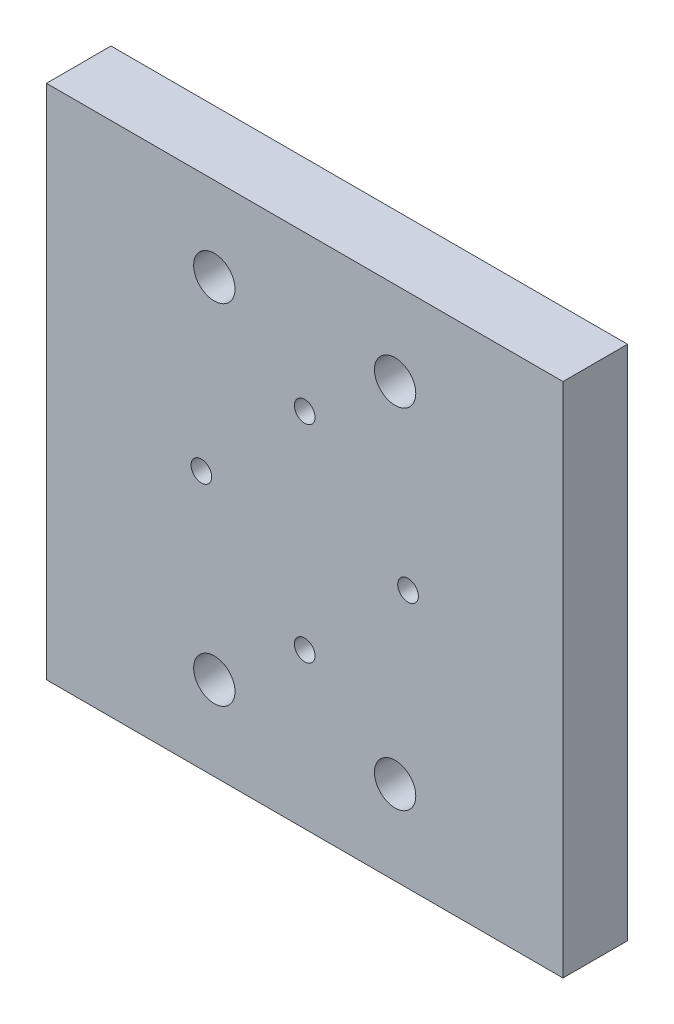
ISO-10303-21;
HEADER;
FILE_DESCRIPTION(('STEP AP214'),'2;1');
FILE_NAME('part.step','',(''),(''),'','','');
FILE_SCHEMA(('AUTOMOTIVE_DESIGN { 1 0 10303 214 1 1 1 1 }'));
ENDSEC;
DATA;
#1=APPLICATION_CONTEXT('core data for automotive mechanical design processes');
#2=APPLICATION_PROTOCOL_DEFINITION('international standard','automotive_design',2000,#1);
#3=PRODUCT_CONTEXT('',#1,'mechanical');
#4=PRODUCT('Part','Part','',(#3));
#5=PRODUCT_RELATED_PRODUCT_CATEGORY('part','',(#4));
#6=PRODUCT_DEFINITION_FORMATION('','',#4);
#7=PRODUCT_DEFINITION_CONTEXT('part definition',#1,'design');
#8=PRODUCT_DEFINITION('design','',#6,#7);
#9=PRODUCT_DEFINITION_SHAPE('','',#8);
#10=(LENGTH_UNIT() NAMED_UNIT(*) SI_UNIT(.MILLI.,.METRE.));
#11=(NAMED_UNIT(*) PLANE_ANGLE_UNIT() SI_UNIT($,.RADIAN.));
#12=(NAMED_UNIT(*) SI_UNIT($,.STERADIAN.) SOLID_ANGLE_UNIT());
#13=UNCERTAINTY_MEASURE_WITH_UNIT(LENGTH_MEASURE(1.E-05),#10,'distance_accuracy_value','');
#14=(GEOMETRIC_REPRESENTATION_CONTEXT(3) GLOBAL_UNCERTAINTY_ASSIGNED_CONTEXT((#13)) GLOBAL_UNIT_ASSIGNED_CONTEXT((#10,
#11,#12)) REPRESENTATION_CONTEXT('',''));
#15=CARTESIAN_POINT('',(0.,0.,0.));
#16=DIRECTION('',(0.,0.,1.));
#17=DIRECTION('',(1.,0.,0.));
#18=AXIS2_PLACEMENT_3D('',#15,#16,#17);
#19=CARTESIAN_POINT('',(0.,0.,5.));
#20=DIRECTION('',(0.,0.,1.));
#21=DIRECTION('',(1.,0.,0.));
#22=AXIS2_PLACEMENT_3D('',#19,#20,#21);
#23=PLANE('',#22);
#24=CARTESIAN_POINT('',(7.,-13.5,5.));
#25=DIRECTION('',(0.,0.,1.));
#26=DIRECTION('',(1.,0.,0.));
#27=AXIS2_PLACEMENT_3D('',#24,#25,#26);
#28=CIRCLE('',#27,1.6);
#29=CARTESIAN_POINT('',(8.6,-13.5,5.));
#30=VERTEX_POINT('',#29);
#31=EDGE_CURVE('E180',#30,#30,#28,.T.);
#32=ORIENTED_EDGE('',*,*,#31,.F.);
#33=EDGE_LOOP('',(#32));
#34=FACE_BOUND('',#33,.T.);
#35=CARTESIAN_POINT('',(7.,13.5,5.));
#36=DIRECTION('',(0.,0.,1.));
#37=DIRECTION('',(1.,0.,0.));
#38=AXIS2_PLACEMENT_3D('',#35,#36,#37);
#39=CIRCLE('',#38,1.6);
#40=CARTESIAN_POINT('',(8.6,13.5,5.));
#41=VERTEX_POINT('',#40);
#42=EDGE_CURVE('E164',#41,#41,#39,.T.);
#43=ORIENTED_EDGE('',*,*,#42,.F.);
#44=EDGE_LOOP('',(#43));
#45=FACE_BOUND('',#44,.T.);
#46=CARTESIAN_POINT('',(8.,0.,5.));
#47=DIRECTION('',(0.,0.,1.));
#48=DIRECTION('',(1.,0.,0.));
#49=AXIS2_PLACEMENT_3D('',#46,#47,#48);
#50=CIRCLE('',#49,0.800000000000001);
#51=CARTESIAN_POINT('',(8.8,0.,5.));
#52=VERTEX_POINT('',#51);
#53=EDGE_CURVE('E148',#52,#52,#50,.T.);
#54=ORIENTED_EDGE('',*,*,#53,.F.);
#55=EDGE_LOOP('',(#54));
#56=FACE_BOUND('',#55,.T.);
#57=CARTESIAN_POINT('',(0.,8.,5.));
#58=DIRECTION('',(0.,0.,1.));
#59=DIRECTION('',(1.,0.,0.));
#60=AXIS2_PLACEMENT_3D('',#57,#58,#59);
#61=CIRCLE('',#60,0.8);
#62=CARTESIAN_POINT('',(0.8,8.,5.));
#63=VERTEX_POINT('',#62);
#64=EDGE_CURVE('E118',#63,#63,#61,.T.);
#65=ORIENTED_EDGE('',*,*,#64,.F.);
#66=EDGE_LOOP('',(#65));
#67=FACE_BOUND('',#66,.T.);
#68=DIRECTION('',(0.,1.,0.));
#69=VECTOR('',#68,1.);
#70=CARTESIAN_POINT('',(20.,20.,5.));
#71=LINE('',#70,#69);
#72=CARTESIAN_POINT('',(20.,-20.,5.));
#73=VERTEX_POINT('',#72);
#74=CARTESIAN_POINT('',(20.,20.,5.));
#75=VERTEX_POINT('',#74);
#76=EDGE_CURVE('E98',#73,#75,#71,.T.);
#77=ORIENTED_EDGE('',*,*,#76,.T.);
#78=DIRECTION('',(-1.,0.,0.));
#79=VECTOR('',#78,1.);
#80=CARTESIAN_POINT('',(-20.,20.,5.));
#81=LINE('',#80,#79);
#82=CARTESIAN_POINT('',(-20.,20.,5.));
#83=VERTEX_POINT('',#82);
#84=EDGE_CURVE('E93',#75,#83,#81,.T.);
#85=ORIENTED_EDGE('',*,*,#84,.T.);
#86=DIRECTION('',(0.,-1.,0.));
#87=VECTOR('',#86,1.);
#88=CARTESIAN_POINT('',(-20.,20.,5.));
#89=LINE('',#88,#87);
#90=CARTESIAN_POINT('',(-20.,-20.,5.));
#91=VERTEX_POINT('',#90);
#92=EDGE_CURVE('E96',#83,#91,#89,.T.);
#93=ORIENTED_EDGE('',*,*,#92,.T.);
#94=DIRECTION('',(1.,0.,0.));
#95=VECTOR('',#94,1.);
#96=CARTESIAN_POINT('',(-20.,-20.,5.));
#97=LINE('',#96,#95);
#98=EDGE_CURVE('E63',#91,#73,#97,.T.);
#99=ORIENTED_EDGE('',*,*,#98,.T.);
#100=EDGE_LOOP('',(#77,#85,#93,#99));
#101=FACE_BOUND('',#100,.T.);
#102=CARTESIAN_POINT('',(-8.,0.,5.));
#103=DIRECTION('',(0.,0.,1.));
#104=DIRECTION('',(1.,0.,0.));
#105=AXIS2_PLACEMENT_3D('',#102,#103,#104);
#106=CIRCLE('',#105,0.800000000000001);
#107=CARTESIAN_POINT('',(-7.2,0.,5.));
#108=VERTEX_POINT('',#107);
#109=EDGE_CURVE('E140',#108,#108,#106,.T.);
#110=ORIENTED_EDGE('',*,*,#109,.F.);
#111=EDGE_LOOP('',(#110));
#112=FACE_BOUND('',#111,.T.);
#113=CARTESIAN_POINT('',(0.,-8.,5.));
#114=DIRECTION('',(0.,0.,1.));
#115=DIRECTION('',(1.,0.,0.));
#116=AXIS2_PLACEMENT_3D('',#113,#114,#115);
#117=CIRCLE('',#116,0.8);
#118=CARTESIAN_POINT('',(0.8,-8.,5.));
#119=VERTEX_POINT('',#118);
#120=EDGE_CURVE('E156',#119,#119,#117,.T.);
#121=ORIENTED_EDGE('',*,*,#120,.F.);
#122=EDGE_LOOP('',(#121));
#123=FACE_BOUND('',#122,.T.);
#124=CARTESIAN_POINT('',(-7.,13.5,5.));
#125=DIRECTION('',(0.,0.,1.));
#126=DIRECTION('',(1.,0.,0.));
#127=AXIS2_PLACEMENT_3D('',#124,#125,#126);
#128=CIRCLE('',#127,1.6);
#129=CARTESIAN_POINT('',(-5.4,13.5,5.));
#130=VERTEX_POINT('',#129);
#131=EDGE_CURVE('E172',#130,#130,#128,.T.);
#132=ORIENTED_EDGE('',*,*,#131,.F.);
#133=EDGE_LOOP('',(#132));
#134=FACE_BOUND('',#133,.T.);
#135=CARTESIAN_POINT('',(-7.,-13.5,5.));
#136=DIRECTION('',(0.,0.,1.));
#137=DIRECTION('',(1.,0.,0.));
#138=AXIS2_PLACEMENT_3D('',#135,#136,#137);
#139=CIRCLE('',#138,1.6);
#140=CARTESIAN_POINT('',(-5.4,-13.5,5.));
#141=VERTEX_POINT('',#140);
#142=EDGE_CURVE('E188',#141,#141,#139,.T.);
#143=ORIENTED_EDGE('',*,*,#142,.F.);
#144=EDGE_LOOP('',(#143));
#145=FACE_BOUND('',#144,.T.);
#146=ADVANCED_FACE('F45',(#34,#45,#56,#67,#101,#112,#123,#134,#145),#23,.T.);
#147=CARTESIAN_POINT('',(0.,0.,0.));
#148=DIRECTION('',(0.,0.,1.));
#149=DIRECTION('',(1.,0.,0.));
#150=AXIS2_PLACEMENT_3D('',#147,#148,#149);
#151=PLANE('',#150);
#152=DIRECTION('',(0.,1.,0.));
#153=VECTOR('',#152,1.);
#154=CARTESIAN_POINT('',(20.,20.,0.));
#155=LINE('',#154,#153);
#156=CARTESIAN_POINT('',(20.,-20.,0.));
#157=VERTEX_POINT('',#156);
#158=CARTESIAN_POINT('',(20.,20.,0.));
#159=VERTEX_POINT('',#158);
#160=EDGE_CURVE('E114',#157,#159,#155,.T.);
#161=ORIENTED_EDGE('',*,*,#160,.F.);
#162=DIRECTION('',(1.,0.,0.));
#163=VECTOR('',#162,1.);
#164=CARTESIAN_POINT('',(-20.,-20.,0.));
#165=LINE('',#164,#163);
#166=CARTESIAN_POINT('',(-20.,-20.,0.));
#167=VERTEX_POINT('',#166);
#168=EDGE_CURVE('E86',#167,#157,#165,.T.);
#169=ORIENTED_EDGE('',*,*,#168,.F.);
#170=DIRECTION('',(0.,-1.,0.));
#171=VECTOR('',#170,1.);
#172=CARTESIAN_POINT('',(-20.,20.,0.));
#173=LINE('',#172,#171);
#174=CARTESIAN_POINT('',(-20.,20.,0.));
#175=VERTEX_POINT('',#174);
#176=EDGE_CURVE('E80',#175,#167,#173,.T.);
#177=ORIENTED_EDGE('',*,*,#176,.F.);
#178=DIRECTION('',(-1.,0.,0.));
#179=VECTOR('',#178,1.);
#180=CARTESIAN_POINT('',(-20.,20.,0.));
#181=LINE('',#180,#179);
#182=EDGE_CURVE('E103',#159,#175,#181,.T.);
#183=ORIENTED_EDGE('',*,*,#182,.F.);
#184=EDGE_LOOP('',(#161,#169,#177,#183));
#185=FACE_BOUND('',#184,.T.);
#186=CARTESIAN_POINT('',(0.,8.,0.));
#187=DIRECTION('',(0.,0.,1.));
#188=DIRECTION('',(1.,0.,0.));
#189=AXIS2_PLACEMENT_3D('',#186,#187,#188);
#190=CIRCLE('',#189,0.8);
#191=CARTESIAN_POINT('',(0.8,8.,0.));
#192=VERTEX_POINT('',#191);
#193=EDGE_CURVE('E136',#192,#192,#190,.T.);
#194=ORIENTED_EDGE('',*,*,#193,.T.);
#195=EDGE_LOOP('',(#194));
#196=FACE_BOUND('',#195,.T.);
#197=CARTESIAN_POINT('',(-8.,0.,0.));
#198=DIRECTION('',(0.,0.,1.));
#199=DIRECTION('',(1.,0.,0.));
#200=AXIS2_PLACEMENT_3D('',#197,#198,#199);
#201=CIRCLE('',#200,0.800000000000001);
#202=CARTESIAN_POINT('',(-7.2,0.,0.));
#203=VERTEX_POINT('',#202);
#204=EDGE_CURVE('E144',#203,#203,#201,.T.);
#205=ORIENTED_EDGE('',*,*,#204,.T.);
#206=EDGE_LOOP('',(#205));
#207=FACE_BOUND('',#206,.T.);
#208=CARTESIAN_POINT('',(8.,0.,0.));
#209=DIRECTION('',(0.,0.,1.));
#210=DIRECTION('',(1.,0.,0.));
#211=AXIS2_PLACEMENT_3D('',#208,#209,#210);
#212=CIRCLE('',#211,0.800000000000001);
#213=CARTESIAN_POINT('',(8.8,0.,0.));
#214=VERTEX_POINT('',#213);
#215=EDGE_CURVE('E152',#214,#214,#212,.T.);
#216=ORIENTED_EDGE('',*,*,#215,.T.);
#217=EDGE_LOOP('',(#216));
#218=FACE_BOUND('',#217,.T.);
#219=CARTESIAN_POINT('',(0.,-8.,0.));
#220=DIRECTION('',(0.,0.,1.));
#221=DIRECTION('',(1.,0.,0.));
#222=AXIS2_PLACEMENT_3D('',#219,#220,#221);
#223=CIRCLE('',#222,0.8);
#224=CARTESIAN_POINT('',(0.8,-8.,0.));
#225=VERTEX_POINT('',#224);
#226=EDGE_CURVE('E160',#225,#225,#223,.T.);
#227=ORIENTED_EDGE('',*,*,#226,.T.);
#228=EDGE_LOOP('',(#227));
#229=FACE_BOUND('',#228,.T.);
#230=CARTESIAN_POINT('',(7.,13.5,0.));
#231=DIRECTION('',(0.,0.,1.));
#232=DIRECTION('',(1.,0.,0.));
#233=AXIS2_PLACEMENT_3D('',#230,#231,#232);
#234=CIRCLE('',#233,1.6);
#235=CARTESIAN_POINT('',(8.6,13.5,0.));
#236=VERTEX_POINT('',#235);
#237=EDGE_CURVE('E168',#236,#236,#234,.T.);
#238=ORIENTED_EDGE('',*,*,#237,.T.);
#239=EDGE_LOOP('',(#238));
#240=FACE_BOUND('',#239,.T.);
#241=CARTESIAN_POINT('',(-7.,13.5,0.));
#242=DIRECTION('',(0.,0.,1.));
#243=DIRECTION('',(1.,0.,0.));
#244=AXIS2_PLACEMENT_3D('',#241,#242,#243);
#245=CIRCLE('',#244,1.6);
#246=CARTESIAN_POINT('',(-5.4,13.5,0.));
#247=VERTEX_POINT('',#246);
#248=EDGE_CURVE('E176',#247,#247,#245,.T.);
#249=ORIENTED_EDGE('',*,*,#248,.T.);
#250=EDGE_LOOP('',(#249));
#251=FACE_BOUND('',#250,.T.);
#252=CARTESIAN_POINT('',(7.,-13.5,0.));
#253=DIRECTION('',(0.,0.,1.));
#254=DIRECTION('',(1.,0.,0.));
#255=AXIS2_PLACEMENT_3D('',#252,#253,#254);
#256=CIRCLE('',#255,1.6);
#257=CARTESIAN_POINT('',(8.6,-13.5,0.));
#258=VERTEX_POINT('',#257);
#259=EDGE_CURVE('E184',#258,#258,#256,.T.);
#260=ORIENTED_EDGE('',*,*,#259,.T.);
#261=EDGE_LOOP('',(#260));
#262=FACE_BOUND('',#261,.T.);
#263=CARTESIAN_POINT('',(-7.,-13.5,0.));
#264=DIRECTION('',(0.,0.,1.));
#265=DIRECTION('',(1.,0.,0.));
#266=AXIS2_PLACEMENT_3D('',#263,#264,#265);
#267=CIRCLE('',#266,1.6);
#268=CARTESIAN_POINT('',(-5.4,-13.5,0.));
#269=VERTEX_POINT('',#268);
#270=EDGE_CURVE('E192',#269,#269,#267,.T.);
#271=ORIENTED_EDGE('',*,*,#270,.T.);
#272=EDGE_LOOP('',(#271));
#273=FACE_BOUND('',#272,.T.);
#274=ADVANCED_FACE('F131',(#185,#196,#207,#218,#229,#240,#251,#262,#273),#151,.F.);
#275=CARTESIAN_POINT('',(20.,20.,5.));
#276=DIRECTION('',(-1.,0.,0.));
#277=DIRECTION('',(0.,-1.,0.));
#278=AXIS2_PLACEMENT_3D('',#275,#276,#277);
#279=PLANE('',#278);
#280=ORIENTED_EDGE('',*,*,#160,.T.);
#281=DIRECTION('',(0.,0.,-1.));
#282=VECTOR('',#281,1.);
#283=CARTESIAN_POINT('',(20.,20.,5.));
#284=LINE('',#283,#282);
#285=EDGE_CURVE('E11',#75,#159,#284,.T.);
#286=ORIENTED_EDGE('',*,*,#285,.F.);
#287=ORIENTED_EDGE('',*,*,#76,.F.);
#288=DIRECTION('',(0.,0.,-1.));
#289=VECTOR('',#288,1.);
#290=CARTESIAN_POINT('',(20.,-20.,5.));
#291=LINE('',#290,#289);
#292=EDGE_CURVE('E110',#73,#157,#291,.T.);
#293=ORIENTED_EDGE('',*,*,#292,.T.);
#294=EDGE_LOOP('',(#280,#286,#287,#293));
#295=FACE_BOUND('',#294,.T.);
#296=ADVANCED_FACE('F47',(#295),#279,.F.);
#297=CARTESIAN_POINT('',(-20.,20.,5.));
#298=DIRECTION('',(0.,-1.,0.));
#299=DIRECTION('',(0.,0.,-1.));
#300=AXIS2_PLACEMENT_3D('',#297,#298,#299);
#301=PLANE('',#300);
#302=ORIENTED_EDGE('',*,*,#182,.T.);
#303=DIRECTION('',(0.,0.,-1.));
#304=VECTOR('',#303,1.);
#305=CARTESIAN_POINT('',(-20.,20.,5.));
#306=LINE('',#305,#304);
#307=EDGE_CURVE('E55',#83,#175,#306,.T.);
#308=ORIENTED_EDGE('',*,*,#307,.F.);
#309=ORIENTED_EDGE('',*,*,#84,.F.);
#310=ORIENTED_EDGE('',*,*,#285,.T.);
#311=EDGE_LOOP('',(#302,#308,#309,#310));
#312=FACE_BOUND('',#311,.T.);
#313=ADVANCED_FACE('F102',(#312),#301,.F.);
#314=CARTESIAN_POINT('',(-20.,20.,5.));
#315=DIRECTION('',(1.,0.,0.));
#316=DIRECTION('',(0.,1.,0.));
#317=AXIS2_PLACEMENT_3D('',#314,#315,#316);
#318=PLANE('',#317);
#319=ORIENTED_EDGE('',*,*,#176,.T.);
#320=DIRECTION('',(0.,0.,-1.));
#321=VECTOR('',#320,1.);
#322=CARTESIAN_POINT('',(-20.,-20.,5.));
#323=LINE('',#322,#321);
#324=EDGE_CURVE('E105',#91,#167,#323,.T.);
#325=ORIENTED_EDGE('',*,*,#324,.F.);
#326=ORIENTED_EDGE('',*,*,#92,.F.);
#327=ORIENTED_EDGE('',*,*,#307,.T.);
#328=EDGE_LOOP('',(#319,#325,#326,#327));
#329=FACE_BOUND('',#328,.T.);
#330=ADVANCED_FACE('F106',(#329),#318,.F.);
#331=CARTESIAN_POINT('',(-20.,-20.,5.));
#332=DIRECTION('',(0.,1.,0.));
#333=DIRECTION('',(0.,0.,1.));
#334=AXIS2_PLACEMENT_3D('',#331,#332,#333);
#335=PLANE('',#334);
#336=ORIENTED_EDGE('',*,*,#168,.T.);
#337=ORIENTED_EDGE('',*,*,#292,.F.);
#338=ORIENTED_EDGE('',*,*,#98,.F.);
#339=ORIENTED_EDGE('',*,*,#324,.T.);
#340=EDGE_LOOP('',(#336,#337,#338,#339));
#341=FACE_BOUND('',#340,.T.);
#342=ADVANCED_FACE('F128',(#341),#335,.F.);
#343=CARTESIAN_POINT('',(0.,8.,5.));
#344=DIRECTION('',(0.,0.,-1.));
#345=DIRECTION('',(-1.,0.,0.));
#346=AXIS2_PLACEMENT_3D('',#343,#344,#345);
#347=CYLINDRICAL_SURFACE('',#346,0.8);
#348=ORIENTED_EDGE('',*,*,#64,.T.);
#349=EDGE_LOOP('',(#348));
#350=FACE_BOUND('',#349,.T.);
#351=ORIENTED_EDGE('',*,*,#193,.F.);
#352=EDGE_LOOP('',(#351));
#353=FACE_BOUND('',#352,.T.);
#354=ADVANCED_FACE('F213',(#350,#353),#347,.F.);
#355=CARTESIAN_POINT('',(-8.,0.,5.));
#356=DIRECTION('',(0.,0.,-1.));
#357=DIRECTION('',(-1.,0.,0.));
#358=AXIS2_PLACEMENT_3D('',#355,#356,#357);
#359=CYLINDRICAL_SURFACE('',#358,0.800000000000001);
#360=ORIENTED_EDGE('',*,*,#109,.T.);
#361=EDGE_LOOP('',(#360));
#362=FACE_BOUND('',#361,.T.);
#363=ORIENTED_EDGE('',*,*,#204,.F.);
#364=EDGE_LOOP('',(#363));
#365=FACE_BOUND('',#364,.T.);
#366=ADVANCED_FACE('F258',(#362,#365),#359,.F.);
#367=CARTESIAN_POINT('',(8.,0.,5.));
#368=DIRECTION('',(0.,0.,-1.));
#369=DIRECTION('',(-1.,0.,0.));
#370=AXIS2_PLACEMENT_3D('',#367,#368,#369);
#371=CYLINDRICAL_SURFACE('',#370,0.800000000000001);
#372=ORIENTED_EDGE('',*,*,#53,.T.);
#373=EDGE_LOOP('',(#372));
#374=FACE_BOUND('',#373,.T.);
#375=ORIENTED_EDGE('',*,*,#215,.F.);
#376=EDGE_LOOP('',(#375));
#377=FACE_BOUND('',#376,.T.);
#378=ADVANCED_FACE('F266',(#374,#377),#371,.F.);
#379=CARTESIAN_POINT('',(0.,-8.,5.));
#380=DIRECTION('',(0.,0.,-1.));
#381=DIRECTION('',(-1.,0.,0.));
#382=AXIS2_PLACEMENT_3D('',#379,#380,#381);
#383=CYLINDRICAL_SURFACE('',#382,0.8);
#384=ORIENTED_EDGE('',*,*,#120,.T.);
#385=EDGE_LOOP('',(#384));
#386=FACE_BOUND('',#385,.T.);
#387=ORIENTED_EDGE('',*,*,#226,.F.);
#388=EDGE_LOOP('',(#387));
#389=FACE_BOUND('',#388,.T.);
#390=ADVANCED_FACE('F274',(#386,#389),#383,.F.);
#391=CARTESIAN_POINT('',(7.,13.5,5.));
#392=DIRECTION('',(0.,0.,-1.));
#393=DIRECTION('',(-1.,0.,0.));
#394=AXIS2_PLACEMENT_3D('',#391,#392,#393);
#395=CYLINDRICAL_SURFACE('',#394,1.6);
#396=ORIENTED_EDGE('',*,*,#42,.T.);
#397=EDGE_LOOP('',(#396));
#398=FACE_BOUND('',#397,.T.);
#399=ORIENTED_EDGE('',*,*,#237,.F.);
#400=EDGE_LOOP('',(#399));
#401=FACE_BOUND('',#400,.T.);
#402=ADVANCED_FACE('F283',(#398,#401),#395,.F.);
#403=CARTESIAN_POINT('',(-7.,13.5,5.));
#404=DIRECTION('',(0.,0.,-1.));
#405=DIRECTION('',(-1.,0.,0.));
#406=AXIS2_PLACEMENT_3D('',#403,#404,#405);
#407=CYLINDRICAL_SURFACE('',#406,1.6);
#408=ORIENTED_EDGE('',*,*,#131,.T.);
#409=EDGE_LOOP('',(#408));
#410=FACE_BOUND('',#409,.T.);
#411=ORIENTED_EDGE('',*,*,#248,.F.);
#412=EDGE_LOOP('',(#411));
#413=FACE_BOUND('',#412,.T.);
#414=ADVANCED_FACE('F292',(#410,#413),#407,.F.);
#415=CARTESIAN_POINT('',(7.,-13.5,5.));
#416=DIRECTION('',(0.,0.,-1.));
#417=DIRECTION('',(-1.,0.,0.));
#418=AXIS2_PLACEMENT_3D('',#415,#416,#417);
#419=CYLINDRICAL_SURFACE('',#418,1.6);
#420=ORIENTED_EDGE('',*,*,#31,.T.);
#421=EDGE_LOOP('',(#420));
#422=FACE_BOUND('',#421,.T.);
#423=ORIENTED_EDGE('',*,*,#259,.F.);
#424=EDGE_LOOP('',(#423));
#425=FACE_BOUND('',#424,.T.);
#426=ADVANCED_FACE('F301',(#422,#425),#419,.F.);
#427=CARTESIAN_POINT('',(-7.,-13.5,5.));
#428=DIRECTION('',(0.,0.,-1.));
#429=DIRECTION('',(-1.,0.,0.));
#430=AXIS2_PLACEMENT_3D('',#427,#428,#429);
#431=CYLINDRICAL_SURFACE('',#430,1.6);
#432=ORIENTED_EDGE('',*,*,#142,.T.);
#433=EDGE_LOOP('',(#432));
#434=FACE_BOUND('',#433,.T.);
#435=ORIENTED_EDGE('',*,*,#270,.F.);
#436=EDGE_LOOP('',(#435));
#437=FACE_BOUND('',#436,.T.);
#438=ADVANCED_FACE('F200',(#434,#437),#431,.F.);
#439=CLOSED_SHELL('',(#146,#274,#296,#313,#330,#342,#354,#366,#378,#390,#402,#414,#426,#438));
#440=MANIFOLD_SOLID_BREP('B2',#439);
#441=ADVANCED_BREP_SHAPE_REPRESENTATION('',(#18,#440),#14);
#442=SHAPE_DEFINITION_REPRESENTATION(#9,#441);
ENDSEC;
END-ISO-10303-21;
